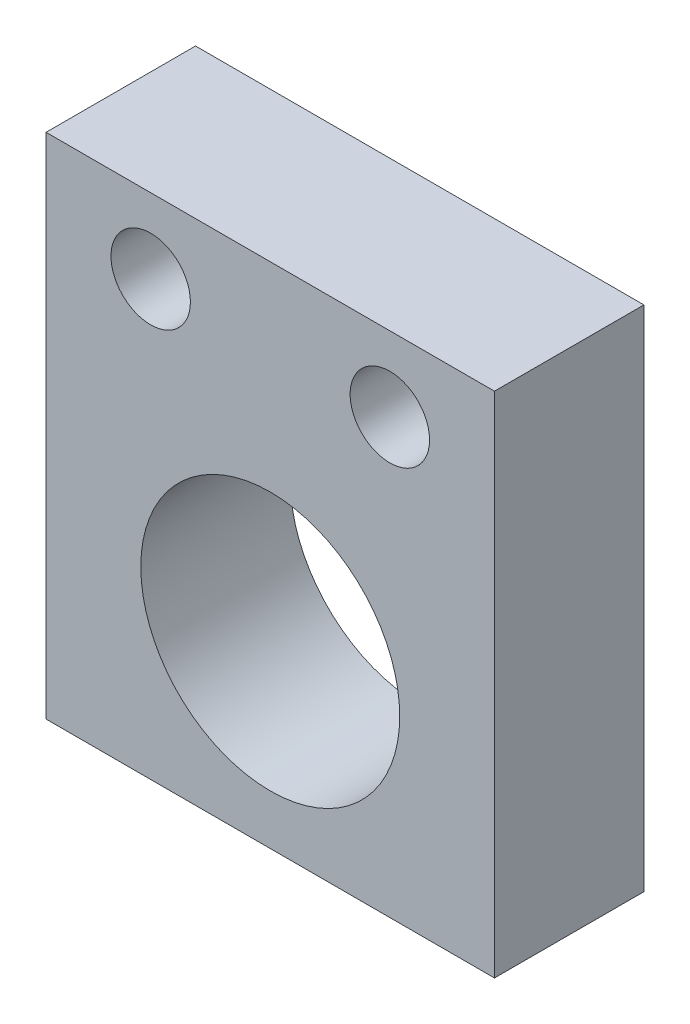
ISO-10303-21;
HEADER;
FILE_DESCRIPTION(('STEP AP214'),'2;1');
FILE_NAME('part.step','',(''),(''),'','','');
FILE_SCHEMA(('AUTOMOTIVE_DESIGN { 1 0 10303 214 1 1 1 1 }'));
ENDSEC;
DATA;
#1=APPLICATION_CONTEXT('core data for automotive mechanical design processes');
#2=APPLICATION_PROTOCOL_DEFINITION('international standard','automotive_design',2000,#1);
#3=PRODUCT_CONTEXT('',#1,'mechanical');
#4=PRODUCT('Part','Part','',(#3));
#5=PRODUCT_RELATED_PRODUCT_CATEGORY('part','',(#4));
#6=PRODUCT_DEFINITION_FORMATION('','',#4);
#7=PRODUCT_DEFINITION_CONTEXT('part definition',#1,'design');
#8=PRODUCT_DEFINITION('design','',#6,#7);
#9=PRODUCT_DEFINITION_SHAPE('','',#8);
#10=(LENGTH_UNIT() NAMED_UNIT(*) SI_UNIT(.MILLI.,.METRE.));
#11=(NAMED_UNIT(*) PLANE_ANGLE_UNIT() SI_UNIT($,.RADIAN.));
#12=(NAMED_UNIT(*) SI_UNIT($,.STERADIAN.) SOLID_ANGLE_UNIT());
#13=UNCERTAINTY_MEASURE_WITH_UNIT(LENGTH_MEASURE(1.E-05),#10,'distance_accuracy_value','');
#14=(GEOMETRIC_REPRESENTATION_CONTEXT(3) GLOBAL_UNCERTAINTY_ASSIGNED_CONTEXT((#13)) GLOBAL_UNIT_ASSIGNED_CONTEXT((#10,
#11,#12)) REPRESENTATION_CONTEXT('',''));
#15=CARTESIAN_POINT('',(0.,0.,0.));
#16=DIRECTION('',(0.,0.,1.));
#17=DIRECTION('',(1.,0.,0.));
#18=AXIS2_PLACEMENT_3D('',#15,#16,#17);
#19=CARTESIAN_POINT('',(0.,0.,-12.7));
#20=DIRECTION('',(0.,0.,-1.));
#21=DIRECTION('',(-1.,0.,0.));
#22=AXIS2_PLACEMENT_3D('',#19,#20,#21);
#23=PLANE('',#22);
#24=CARTESIAN_POINT('',(29.21,36.83,-12.7));
#25=DIRECTION('',(0.,0.,1.));
#26=DIRECTION('',(1.,0.,0.));
#27=AXIS2_PLACEMENT_3D('',#24,#25,#26);
#28=CIRCLE('',#27,3.37350099999999);
#29=CARTESIAN_POINT('',(32.583501,36.83,-12.7));
#30=VERTEX_POINT('',#29);
#31=EDGE_CURVE('E116',#30,#30,#28,.T.);
#32=ORIENTED_EDGE('',*,*,#31,.T.);
#33=EDGE_LOOP('',(#32));
#34=FACE_BOUND('',#33,.T.);
#35=DIRECTION('',(0.,-1.,0.));
#36=VECTOR('',#35,1.);
#37=CARTESIAN_POINT('',(0.,0.,-12.7));
#38=LINE('',#37,#36);
#39=CARTESIAN_POINT('',(0.,43.18,-12.7));
#40=VERTEX_POINT('',#39);
#41=CARTESIAN_POINT('',(0.,0.,-12.7));
#42=VERTEX_POINT('',#41);
#43=EDGE_CURVE('E136',#40,#42,#38,.T.);
#44=ORIENTED_EDGE('',*,*,#43,.F.);
#45=DIRECTION('',(-1.,0.,0.));
#46=VECTOR('',#45,1.);
#47=CARTESIAN_POINT('',(0.,43.18,-12.7));
#48=LINE('',#47,#46);
#49=CARTESIAN_POINT('',(38.1,43.18,-12.7));
#50=VERTEX_POINT('',#49);
#51=EDGE_CURVE('E143',#50,#40,#48,.T.);
#52=ORIENTED_EDGE('',*,*,#51,.F.);
#53=DIRECTION('',(0.,1.,0.));
#54=VECTOR('',#53,1.);
#55=CARTESIAN_POINT('',(38.1,0.,-12.7));
#56=LINE('',#55,#54);
#57=CARTESIAN_POINT('',(38.1,0.,-12.7));
#58=VERTEX_POINT('',#57);
#59=EDGE_CURVE('E141',#58,#50,#56,.T.);
#60=ORIENTED_EDGE('',*,*,#59,.F.);
#61=DIRECTION('',(1.,0.,0.));
#62=VECTOR('',#61,1.);
#63=CARTESIAN_POINT('',(0.,0.,-12.7));
#64=LINE('',#63,#62);
#65=EDGE_CURVE('E138',#42,#58,#64,.T.);
#66=ORIENTED_EDGE('',*,*,#65,.F.);
#67=EDGE_LOOP('',(#44,#52,#60,#66));
#68=FACE_BOUND('',#67,.T.);
#69=CARTESIAN_POINT('',(19.05,15.24,-12.7));
#70=DIRECTION('',(0.,0.,1.));
#71=DIRECTION('',(1.,0.,0.));
#72=AXIS2_PLACEMENT_3D('',#69,#70,#71);
#73=CIRCLE('',#72,11.);
#74=CARTESIAN_POINT('',(30.05,15.24,-12.7));
#75=VERTEX_POINT('',#74);
#76=EDGE_CURVE('E130',#75,#75,#73,.T.);
#77=ORIENTED_EDGE('',*,*,#76,.T.);
#78=EDGE_LOOP('',(#77));
#79=FACE_BOUND('',#78,.T.);
#80=CARTESIAN_POINT('',(8.89,36.83,-12.7));
#81=DIRECTION('',(0.,0.,1.));
#82=DIRECTION('',(1.,0.,0.));
#83=AXIS2_PLACEMENT_3D('',#80,#81,#82);
#84=CIRCLE('',#83,3.373501);
#85=CARTESIAN_POINT('',(12.263501,36.83,-12.7));
#86=VERTEX_POINT('',#85);
#87=EDGE_CURVE('E126',#86,#86,#84,.T.);
#88=ORIENTED_EDGE('',*,*,#87,.T.);
#89=EDGE_LOOP('',(#88));
#90=FACE_BOUND('',#89,.T.);
#91=ADVANCED_FACE('F52',(#34,#68,#79,#90),#23,.T.);
#92=CARTESIAN_POINT('',(0.,0.,-12.7));
#93=DIRECTION('',(-1.,0.,0.));
#94=DIRECTION('',(0.,0.,1.));
#95=AXIS2_PLACEMENT_3D('',#92,#93,#94);
#96=PLANE('',#95);
#97=CARTESIAN_POINT('',(0.,27.94,-6.34999999999999));
#98=DIRECTION('',(-1.,0.,0.));
#99=DIRECTION('',(0.,0.,1.));
#100=AXIS2_PLACEMENT_3D('',#97,#98,#99);
#101=CIRCLE('',#100,2.55269999999999);
#102=CARTESIAN_POINT('',(0.,27.94,-3.7973));
#103=VERTEX_POINT('',#102);
#104=EDGE_CURVE('E113',#103,#103,#101,.T.);
#105=ORIENTED_EDGE('',*,*,#104,.F.);
#106=EDGE_LOOP('',(#105));
#107=FACE_BOUND('',#106,.T.);
#108=DIRECTION('',(0.,-1.,0.));
#109=VECTOR('',#108,1.);
#110=CARTESIAN_POINT('',(0.,0.,0.));
#111=LINE('',#110,#109);
#112=CARTESIAN_POINT('',(0.,43.18,0.));
#113=VERTEX_POINT('',#112);
#114=CARTESIAN_POINT('',(0.,0.,0.));
#115=VERTEX_POINT('',#114);
#116=EDGE_CURVE('E133',#113,#115,#111,.T.);
#117=ORIENTED_EDGE('',*,*,#116,.F.);
#118=DIRECTION('',(0.,0.,1.));
#119=VECTOR('',#118,1.);
#120=CARTESIAN_POINT('',(0.,43.18,-12.7));
#121=LINE('',#120,#119);
#122=EDGE_CURVE('E13',#40,#113,#121,.T.);
#123=ORIENTED_EDGE('',*,*,#122,.F.);
#124=ORIENTED_EDGE('',*,*,#43,.T.);
#125=DIRECTION('',(0.,0.,1.));
#126=VECTOR('',#125,1.);
#127=CARTESIAN_POINT('',(0.,0.,-12.7));
#128=LINE('',#127,#126);
#129=EDGE_CURVE('E56',#42,#115,#128,.T.);
#130=ORIENTED_EDGE('',*,*,#129,.T.);
#131=EDGE_LOOP('',(#117,#123,#124,#130));
#132=FACE_BOUND('',#131,.T.);
#133=ADVANCED_FACE('F54',(#107,#132),#96,.T.);
#134=CARTESIAN_POINT('',(0.,43.18,-12.7));
#135=DIRECTION('',(0.,1.,0.));
#136=DIRECTION('',(0.,0.,1.));
#137=AXIS2_PLACEMENT_3D('',#134,#135,#136);
#138=PLANE('',#137);
#139=DIRECTION('',(-1.,0.,0.));
#140=VECTOR('',#139,1.);
#141=CARTESIAN_POINT('',(0.,43.18,0.));
#142=LINE('',#141,#140);
#143=CARTESIAN_POINT('',(38.1,43.18,0.));
#144=VERTEX_POINT('',#143);
#145=EDGE_CURVE('E139',#144,#113,#142,.T.);
#146=ORIENTED_EDGE('',*,*,#145,.F.);
#147=DIRECTION('',(0.,0.,1.));
#148=VECTOR('',#147,1.);
#149=CARTESIAN_POINT('',(38.1,43.18,-12.7));
#150=LINE('',#149,#148);
#151=EDGE_CURVE('E62',#50,#144,#150,.T.);
#152=ORIENTED_EDGE('',*,*,#151,.F.);
#153=ORIENTED_EDGE('',*,*,#51,.T.);
#154=ORIENTED_EDGE('',*,*,#122,.T.);
#155=EDGE_LOOP('',(#146,#152,#153,#154));
#156=FACE_BOUND('',#155,.T.);
#157=ADVANCED_FACE('F158',(#156),#138,.T.);
#158=CARTESIAN_POINT('',(38.1,0.,-12.7));
#159=DIRECTION('',(1.,0.,0.));
#160=DIRECTION('',(0.,0.,-1.));
#161=AXIS2_PLACEMENT_3D('',#158,#159,#160);
#162=PLANE('',#161);
#163=DIRECTION('',(0.,1.,0.));
#164=VECTOR('',#163,1.);
#165=CARTESIAN_POINT('',(38.1,0.,0.));
#166=LINE('',#165,#164);
#167=CARTESIAN_POINT('',(38.1,0.,0.));
#168=VERTEX_POINT('',#167);
#169=EDGE_CURVE('E150',#168,#144,#166,.T.);
#170=ORIENTED_EDGE('',*,*,#169,.F.);
#171=DIRECTION('',(0.,0.,1.));
#172=VECTOR('',#171,1.);
#173=CARTESIAN_POINT('',(38.1,0.,-12.7));
#174=LINE('',#173,#172);
#175=EDGE_CURVE('E154',#58,#168,#174,.T.);
#176=ORIENTED_EDGE('',*,*,#175,.F.);
#177=ORIENTED_EDGE('',*,*,#59,.T.);
#178=ORIENTED_EDGE('',*,*,#151,.T.);
#179=EDGE_LOOP('',(#170,#176,#177,#178));
#180=FACE_BOUND('',#179,.T.);
#181=ADVANCED_FACE('F161',(#180),#162,.T.);
#182=CARTESIAN_POINT('',(0.,0.,-12.7));
#183=DIRECTION('',(0.,-1.,0.));
#184=DIRECTION('',(0.,0.,-1.));
#185=AXIS2_PLACEMENT_3D('',#182,#183,#184);
#186=PLANE('',#185);
#187=DIRECTION('',(1.,0.,0.));
#188=VECTOR('',#187,1.);
#189=CARTESIAN_POINT('',(0.,0.,0.));
#190=LINE('',#189,#188);
#191=EDGE_CURVE('E147',#115,#168,#190,.T.);
#192=ORIENTED_EDGE('',*,*,#191,.F.);
#193=ORIENTED_EDGE('',*,*,#129,.F.);
#194=ORIENTED_EDGE('',*,*,#65,.T.);
#195=ORIENTED_EDGE('',*,*,#175,.T.);
#196=EDGE_LOOP('',(#192,#193,#194,#195));
#197=FACE_BOUND('',#196,.T.);
#198=ADVANCED_FACE('F155',(#197),#186,.T.);
#199=CARTESIAN_POINT('',(0.,0.,0.));
#200=DIRECTION('',(0.,0.,-1.));
#201=DIRECTION('',(-1.,0.,0.));
#202=AXIS2_PLACEMENT_3D('',#199,#200,#201);
#203=PLANE('',#202);
#204=CARTESIAN_POINT('',(29.21,36.83,0.));
#205=DIRECTION('',(0.,0.,1.));
#206=DIRECTION('',(1.,0.,0.));
#207=AXIS2_PLACEMENT_3D('',#204,#205,#206);
#208=CIRCLE('',#207,3.373501);
#209=CARTESIAN_POINT('',(32.583501,36.83,0.));
#210=VERTEX_POINT('',#209);
#211=EDGE_CURVE('E112',#210,#210,#208,.T.);
#212=ORIENTED_EDGE('',*,*,#211,.F.);
#213=EDGE_LOOP('',(#212));
#214=FACE_BOUND('',#213,.T.);
#215=CARTESIAN_POINT('',(8.89,36.83,0.));
#216=DIRECTION('',(0.,0.,1.));
#217=DIRECTION('',(1.,0.,0.));
#218=AXIS2_PLACEMENT_3D('',#215,#216,#217);
#219=CIRCLE('',#218,3.373501);
#220=CARTESIAN_POINT('',(12.263501,36.83,0.));
#221=VERTEX_POINT('',#220);
#222=EDGE_CURVE('E123',#221,#221,#219,.T.);
#223=ORIENTED_EDGE('',*,*,#222,.F.);
#224=EDGE_LOOP('',(#223));
#225=FACE_BOUND('',#224,.T.);
#226=CARTESIAN_POINT('',(19.05,15.24,0.));
#227=DIRECTION('',(0.,0.,1.));
#228=DIRECTION('',(1.,0.,0.));
#229=AXIS2_PLACEMENT_3D('',#226,#227,#228);
#230=CIRCLE('',#229,11.);
#231=CARTESIAN_POINT('',(30.05,15.24,0.));
#232=VERTEX_POINT('',#231);
#233=EDGE_CURVE('E129',#232,#232,#230,.T.);
#234=ORIENTED_EDGE('',*,*,#233,.F.);
#235=EDGE_LOOP('',(#234));
#236=FACE_BOUND('',#235,.T.);
#237=ORIENTED_EDGE('',*,*,#116,.T.);
#238=ORIENTED_EDGE('',*,*,#191,.T.);
#239=ORIENTED_EDGE('',*,*,#169,.T.);
#240=ORIENTED_EDGE('',*,*,#145,.T.);
#241=EDGE_LOOP('',(#237,#238,#239,#240));
#242=FACE_BOUND('',#241,.T.);
#243=ADVANCED_FACE('F157',(#214,#225,#236,#242),#203,.F.);
#244=CARTESIAN_POINT('',(19.05,15.24,-12.7));
#245=DIRECTION('',(0.,0.,1.));
#246=DIRECTION('',(1.,0.,0.));
#247=AXIS2_PLACEMENT_3D('',#244,#245,#246);
#248=CYLINDRICAL_SURFACE('',#247,11.);
#249=ORIENTED_EDGE('',*,*,#76,.F.);
#250=EDGE_LOOP('',(#249));
#251=FACE_BOUND('',#250,.T.);
#252=ORIENTED_EDGE('',*,*,#233,.T.);
#253=EDGE_LOOP('',(#252));
#254=FACE_BOUND('',#253,.T.);
#255=ADVANCED_FACE('F174',(#251,#254),#248,.F.);
#256=CARTESIAN_POINT('',(8.89,36.83,0.));
#257=DIRECTION('',(0.,0.,1.));
#258=DIRECTION('',(1.,0.,0.));
#259=AXIS2_PLACEMENT_3D('',#256,#257,#258);
#260=CYLINDRICAL_SURFACE('',#259,3.373501);
#261=ORIENTED_EDGE('',*,*,#87,.F.);
#262=EDGE_LOOP('',(#261));
#263=FACE_BOUND('',#262,.T.);
#264=ORIENTED_EDGE('',*,*,#222,.T.);
#265=EDGE_LOOP('',(#264));
#266=FACE_BOUND('',#265,.T.);
#267=ADVANCED_FACE('F171',(#263,#266),#260,.F.);
#268=CARTESIAN_POINT('',(29.21,36.83,0.));
#269=DIRECTION('',(0.,0.,1.));
#270=DIRECTION('',(1.,0.,0.));
#271=AXIS2_PLACEMENT_3D('',#268,#269,#270);
#272=CYLINDRICAL_SURFACE('',#271,3.373501);
#273=ORIENTED_EDGE('',*,*,#31,.F.);
#274=EDGE_LOOP('',(#273));
#275=FACE_BOUND('',#274,.T.);
#276=ORIENTED_EDGE('',*,*,#211,.T.);
#277=EDGE_LOOP('',(#276));
#278=FACE_BOUND('',#277,.T.);
#279=ADVANCED_FACE('F106',(#275,#278),#272,.F.);
#280=CARTESIAN_POINT('',(12.7,27.94,-6.34999999999999));
#281=DIRECTION('',(-1.,0.,0.));
#282=DIRECTION('',(0.,0.,1.));
#283=AXIS2_PLACEMENT_3D('',#280,#281,#282);
#284=CONICAL_SURFACE('',#283,2.5527,1.02974425867665);
#285=CARTESIAN_POINT('',(14.2338169021917,27.94,-6.34999999999999));
#286=VERTEX_POINT('',#285);
#287=VERTEX_LOOP('',#286);
#288=FACE_BOUND('',#287,.T.);
#289=CARTESIAN_POINT('',(12.7,27.94,-6.34999999999999));
#290=DIRECTION('',(-1.,0.,0.));
#291=DIRECTION('',(0.,0.,1.));
#292=AXIS2_PLACEMENT_3D('',#289,#290,#291);
#293=CIRCLE('',#292,2.5527);
#294=CARTESIAN_POINT('',(12.7,27.94,-3.7973));
#295=VERTEX_POINT('',#294);
#296=EDGE_CURVE('E110',#295,#295,#293,.T.);
#297=ORIENTED_EDGE('',*,*,#296,.T.);
#298=EDGE_LOOP('',(#297));
#299=FACE_BOUND('',#298,.T.);
#300=ADVANCED_FACE('F102',(#288,#299),#284,.F.);
#301=CARTESIAN_POINT('',(0.,27.94,-6.34999999999999));
#302=DIRECTION('',(-1.,0.,0.));
#303=DIRECTION('',(0.,0.,1.));
#304=AXIS2_PLACEMENT_3D('',#301,#302,#303);
#305=CYLINDRICAL_SURFACE('',#304,2.55269999999999);
#306=ORIENTED_EDGE('',*,*,#296,.F.);
#307=EDGE_LOOP('',(#306));
#308=FACE_BOUND('',#307,.T.);
#309=ORIENTED_EDGE('',*,*,#104,.T.);
#310=EDGE_LOOP('',(#309));
#311=FACE_BOUND('',#310,.T.);
#312=ADVANCED_FACE('F105',(#308,#311),#305,.F.);
#313=CLOSED_SHELL('',(#91,#133,#157,#181,#198,#243,#255,#267,#279,#300,#312));
#314=MANIFOLD_SOLID_BREP('B2',#313);
#315=ADVANCED_BREP_SHAPE_REPRESENTATION('',(#18,#314),#14);
#316=SHAPE_DEFINITION_REPRESENTATION(#9,#315);
ENDSEC;
END-ISO-10303-21;
